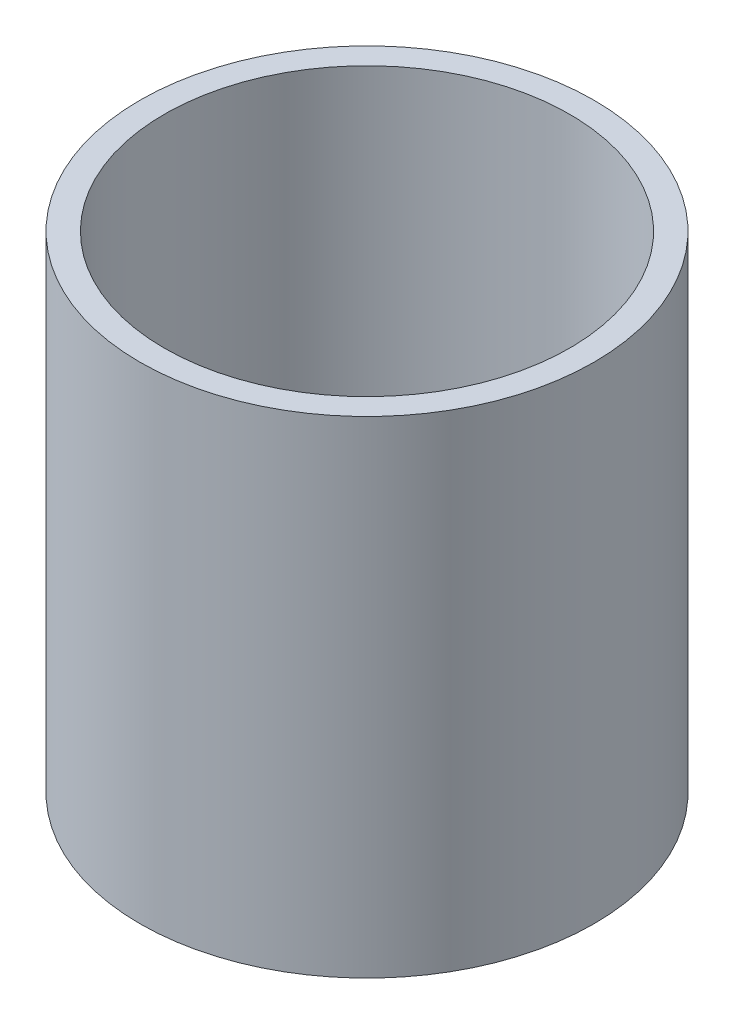
ISO-10303-21;
HEADER;
FILE_DESCRIPTION(('STEP AP214'),'2;1');
FILE_NAME('part.step','',(''),(''),'','','');
FILE_SCHEMA(('AUTOMOTIVE_DESIGN { 1 0 10303 214 1 1 1 1 }'));
ENDSEC;
DATA;
#1=APPLICATION_CONTEXT('core data for automotive mechanical design processes');
#2=APPLICATION_PROTOCOL_DEFINITION('international standard','automotive_design',2000,#1);
#3=PRODUCT_CONTEXT('',#1,'mechanical');
#4=PRODUCT('Part','Part','',(#3));
#5=PRODUCT_RELATED_PRODUCT_CATEGORY('part','',(#4));
#6=PRODUCT_DEFINITION_FORMATION('','',#4);
#7=PRODUCT_DEFINITION_CONTEXT('part definition',#1,'design');
#8=PRODUCT_DEFINITION('design','',#6,#7);
#9=PRODUCT_DEFINITION_SHAPE('','',#8);
#10=(LENGTH_UNIT() NAMED_UNIT(*) SI_UNIT(.MILLI.,.METRE.));
#11=(NAMED_UNIT(*) PLANE_ANGLE_UNIT() SI_UNIT($,.RADIAN.));
#12=(NAMED_UNIT(*) SI_UNIT($,.STERADIAN.) SOLID_ANGLE_UNIT());
#13=UNCERTAINTY_MEASURE_WITH_UNIT(LENGTH_MEASURE(1.E-05),#10,'distance_accuracy_value','');
#14=(GEOMETRIC_REPRESENTATION_CONTEXT(3) GLOBAL_UNCERTAINTY_ASSIGNED_CONTEXT((#13)) GLOBAL_UNIT_ASSIGNED_CONTEXT((#10,
#11,#12)) REPRESENTATION_CONTEXT('',''));
#15=CARTESIAN_POINT('',(0.,0.,0.));
#16=DIRECTION('',(0.,0.,1.));
#17=DIRECTION('',(1.,0.,0.));
#18=AXIS2_PLACEMENT_3D('',#15,#16,#17);
#19=CARTESIAN_POINT('',(0.,60.,0.));
#20=DIRECTION('',(0.,1.,0.));
#21=DIRECTION('',(0.,0.,1.));
#22=AXIS2_PLACEMENT_3D('',#19,#20,#21);
#23=PLANE('',#22);
#24=CARTESIAN_POINT('',(0.,60.,0.));
#25=DIRECTION('',(0.,1.,0.));
#26=DIRECTION('',(0.,0.,1.));
#27=AXIS2_PLACEMENT_3D('',#24,#25,#26);
#28=CIRCLE('',#27,28.);
#29=CARTESIAN_POINT('',(0.,60.,28.));
#30=VERTEX_POINT('',#29);
#31=EDGE_CURVE('E10',#30,#30,#28,.T.);
#32=ORIENTED_EDGE('',*,*,#31,.T.);
#33=EDGE_LOOP('',(#32));
#34=FACE_BOUND('',#33,.T.);
#35=CARTESIAN_POINT('',(0.,60.,0.));
#36=DIRECTION('',(0.,1.,0.));
#37=DIRECTION('',(0.,0.,1.));
#38=AXIS2_PLACEMENT_3D('',#35,#36,#37);
#39=CIRCLE('',#38,25.);
#40=CARTESIAN_POINT('',(0.,60.,25.));
#41=VERTEX_POINT('',#40);
#42=EDGE_CURVE('E54',#41,#41,#39,.T.);
#43=ORIENTED_EDGE('',*,*,#42,.F.);
#44=EDGE_LOOP('',(#43));
#45=FACE_BOUND('',#44,.T.);
#46=ADVANCED_FACE('F41',(#34,#45),#23,.T.);
#47=CARTESIAN_POINT('',(0.,0.,0.));
#48=DIRECTION('',(0.,1.,0.));
#49=DIRECTION('',(0.,0.,1.));
#50=AXIS2_PLACEMENT_3D('',#47,#48,#49);
#51=PLANE('',#50);
#52=CARTESIAN_POINT('',(0.,0.,0.));
#53=DIRECTION('',(0.,1.,0.));
#54=DIRECTION('',(0.,0.,1.));
#55=AXIS2_PLACEMENT_3D('',#52,#53,#54);
#56=CIRCLE('',#55,28.);
#57=CARTESIAN_POINT('',(0.,0.,28.));
#58=VERTEX_POINT('',#57);
#59=EDGE_CURVE('E45',#58,#58,#56,.T.);
#60=ORIENTED_EDGE('',*,*,#59,.F.);
#61=EDGE_LOOP('',(#60));
#62=FACE_BOUND('',#61,.T.);
#63=CARTESIAN_POINT('',(0.,0.,0.));
#64=DIRECTION('',(0.,1.,0.));
#65=DIRECTION('',(0.,0.,1.));
#66=AXIS2_PLACEMENT_3D('',#63,#64,#65);
#67=CIRCLE('',#66,25.);
#68=CARTESIAN_POINT('',(0.,0.,25.));
#69=VERTEX_POINT('',#68);
#70=EDGE_CURVE('E56',#69,#69,#67,.T.);
#71=ORIENTED_EDGE('',*,*,#70,.T.);
#72=EDGE_LOOP('',(#71));
#73=FACE_BOUND('',#72,.T.);
#74=ADVANCED_FACE('F68',(#62,#73),#51,.F.);
#75=CARTESIAN_POINT('',(0.,60.,0.));
#76=DIRECTION('',(0.,-1.,0.));
#77=DIRECTION('',(0.,0.,-1.));
#78=AXIS2_PLACEMENT_3D('',#75,#76,#77);
#79=CYLINDRICAL_SURFACE('',#78,28.);
#80=ORIENTED_EDGE('',*,*,#31,.F.);
#81=EDGE_LOOP('',(#80));
#82=FACE_BOUND('',#81,.T.);
#83=ORIENTED_EDGE('',*,*,#59,.T.);
#84=EDGE_LOOP('',(#83));
#85=FACE_BOUND('',#84,.T.);
#86=ADVANCED_FACE('F43',(#82,#85),#79,.T.);
#87=CARTESIAN_POINT('',(0.,60.,0.));
#88=DIRECTION('',(0.,-1.,0.));
#89=DIRECTION('',(0.,0.,-1.));
#90=AXIS2_PLACEMENT_3D('',#87,#88,#89);
#91=CYLINDRICAL_SURFACE('',#90,25.);
#92=ORIENTED_EDGE('',*,*,#42,.T.);
#93=EDGE_LOOP('',(#92));
#94=FACE_BOUND('',#93,.T.);
#95=ORIENTED_EDGE('',*,*,#70,.F.);
#96=EDGE_LOOP('',(#95));
#97=FACE_BOUND('',#96,.T.);
#98=ADVANCED_FACE('F64',(#94,#97),#91,.F.);
#99=CLOSED_SHELL('',(#46,#74,#86,#98));
#100=MANIFOLD_SOLID_BREP('B2',#99);
#101=ADVANCED_BREP_SHAPE_REPRESENTATION('',(#18,#100),#14);
#102=SHAPE_DEFINITION_REPRESENTATION(#9,#101);
ENDSEC;
END-ISO-10303-21;
